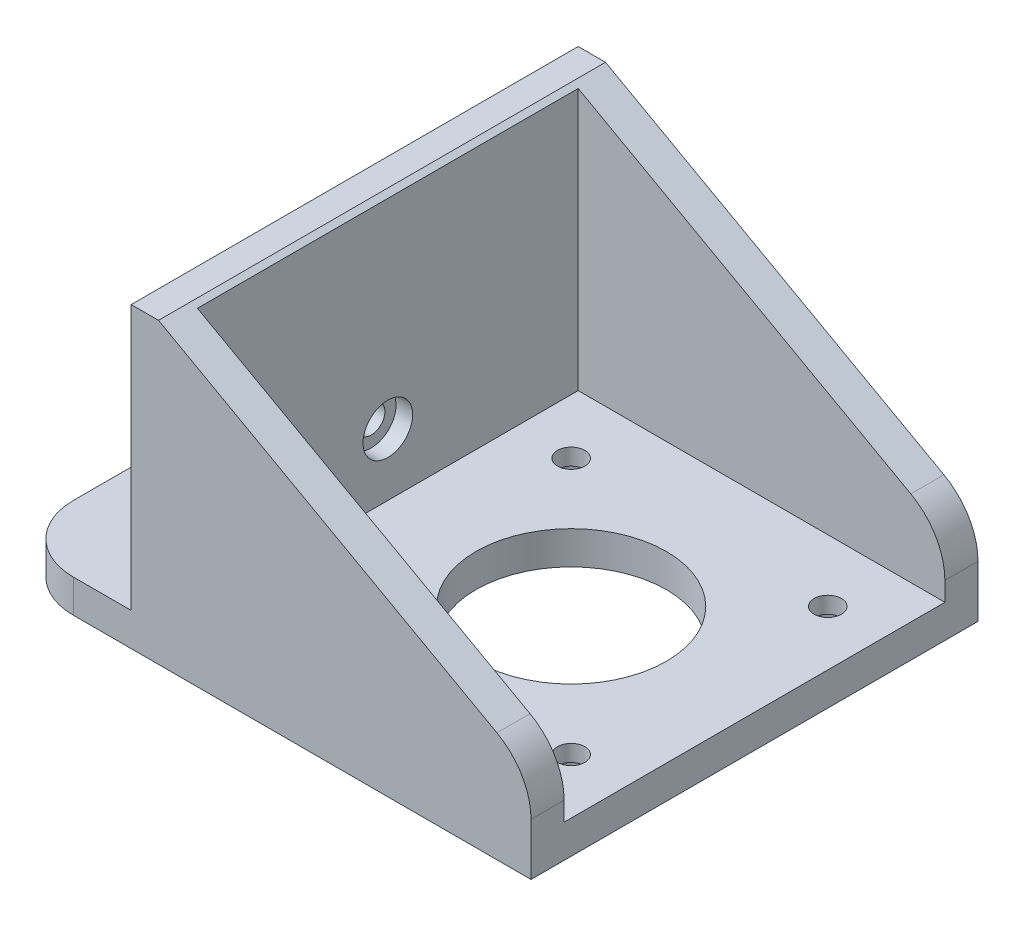
ISO-10303-21;
HEADER;
FILE_DESCRIPTION(('STEP AP214'),'2;1');
FILE_NAME('part.step','',(''),(''),'','','');
FILE_SCHEMA(('AUTOMOTIVE_DESIGN { 1 0 10303 214 1 1 1 1 }'));
ENDSEC;
DATA;
#1=APPLICATION_CONTEXT('core data for automotive mechanical design processes');
#2=APPLICATION_PROTOCOL_DEFINITION('international standard','automotive_design',2000,#1);
#3=PRODUCT_CONTEXT('',#1,'mechanical');
#4=PRODUCT('Part','Part','',(#3));
#5=PRODUCT_RELATED_PRODUCT_CATEGORY('part','',(#4));
#6=PRODUCT_DEFINITION_FORMATION('','',#4);
#7=PRODUCT_DEFINITION_CONTEXT('part definition',#1,'design');
#8=PRODUCT_DEFINITION('design','',#6,#7);
#9=PRODUCT_DEFINITION_SHAPE('','',#8);
#10=(LENGTH_UNIT() NAMED_UNIT(*) SI_UNIT(.MILLI.,.METRE.));
#11=(NAMED_UNIT(*) PLANE_ANGLE_UNIT() SI_UNIT($,.RADIAN.));
#12=(NAMED_UNIT(*) SI_UNIT($,.STERADIAN.) SOLID_ANGLE_UNIT());
#13=UNCERTAINTY_MEASURE_WITH_UNIT(LENGTH_MEASURE(1.E-05),#10,'distance_accuracy_value','');
#14=(GEOMETRIC_REPRESENTATION_CONTEXT(3) GLOBAL_UNCERTAINTY_ASSIGNED_CONTEXT((#13)) GLOBAL_UNIT_ASSIGNED_CONTEXT((#10,
#11,#12)) REPRESENTATION_CONTEXT('',''));
#15=CARTESIAN_POINT('',(0.,0.,0.));
#16=DIRECTION('',(0.,0.,1.));
#17=DIRECTION('',(1.,0.,0.));
#18=AXIS2_PLACEMENT_3D('',#15,#16,#17);
#19=CARTESIAN_POINT('',(236.65,65.998,245.5));
#20=DIRECTION('',(0.,1.,0.));
#21=DIRECTION('',(0.,0.,1.));
#22=AXIS2_PLACEMENT_3D('',#19,#20,#21);
#23=CYLINDRICAL_SURFACE('',#22,1.65);
#24=CARTESIAN_POINT('',(236.65,70.,245.5));
#25=DIRECTION('',(0.,-1.,0.));
#26=DIRECTION('',(1.,0.,0.));
#27=AXIS2_PLACEMENT_3D('',#24,#25,#26);
#28=CIRCLE('',#27,1.65);
#29=CARTESIAN_POINT('',(238.3,70.,245.5));
#30=VERTEX_POINT('',#29);
#31=EDGE_CURVE('E200',#30,#30,#28,.T.);
#32=ORIENTED_EDGE('',*,*,#31,.F.);
#33=EDGE_LOOP('',(#32));
#34=FACE_BOUND('',#33,.T.);
#35=CARTESIAN_POINT('',(236.65,68.,245.5));
#36=DIRECTION('',(0.,-1.,0.));
#37=DIRECTION('',(0.,0.,-1.));
#38=AXIS2_PLACEMENT_3D('',#35,#36,#37);
#39=CIRCLE('',#38,1.65);
#40=CARTESIAN_POINT('',(236.65,68.,243.85));
#41=VERTEX_POINT('',#40);
#42=EDGE_CURVE('E516',#41,#41,#39,.T.);
#43=ORIENTED_EDGE('',*,*,#42,.T.);
#44=EDGE_LOOP('',(#43));
#45=FACE_BOUND('',#44,.T.);
#46=ADVANCED_FACE('F16',(#34,#45),#23,.F.);
#47=CARTESIAN_POINT('',(205.65,65.998,245.5));
#48=DIRECTION('',(0.,1.,0.));
#49=DIRECTION('',(0.,0.,1.));
#50=AXIS2_PLACEMENT_3D('',#47,#48,#49);
#51=CYLINDRICAL_SURFACE('',#50,1.65);
#52=CARTESIAN_POINT('',(205.65,70.,245.5));
#53=DIRECTION('',(0.,-1.,0.));
#54=DIRECTION('',(1.,0.,0.));
#55=AXIS2_PLACEMENT_3D('',#52,#53,#54);
#56=CIRCLE('',#55,1.65);
#57=CARTESIAN_POINT('',(207.3,70.,245.5));
#58=VERTEX_POINT('',#57);
#59=EDGE_CURVE('E745',#58,#58,#56,.T.);
#60=ORIENTED_EDGE('',*,*,#59,.F.);
#61=EDGE_LOOP('',(#60));
#62=FACE_BOUND('',#61,.T.);
#63=CARTESIAN_POINT('',(205.65,68.,245.5));
#64=DIRECTION('',(0.,-1.,0.));
#65=DIRECTION('',(0.,0.,-1.));
#66=AXIS2_PLACEMENT_3D('',#63,#64,#65);
#67=CIRCLE('',#66,1.65);
#68=CARTESIAN_POINT('',(205.65,68.,243.85));
#69=VERTEX_POINT('',#68);
#70=EDGE_CURVE('E521',#69,#69,#67,.T.);
#71=ORIENTED_EDGE('',*,*,#70,.T.);
#72=EDGE_LOOP('',(#71));
#73=FACE_BOUND('',#72,.T.);
#74=ADVANCED_FACE('F653',(#62,#73),#51,.F.);
#75=CARTESIAN_POINT('',(205.65,65.998,214.5));
#76=DIRECTION('',(0.,1.,0.));
#77=DIRECTION('',(0.,0.,1.));
#78=AXIS2_PLACEMENT_3D('',#75,#76,#77);
#79=CYLINDRICAL_SURFACE('',#78,1.65);
#80=CARTESIAN_POINT('',(205.65,70.,214.5));
#81=DIRECTION('',(0.,-1.,0.));
#82=DIRECTION('',(1.,0.,0.));
#83=AXIS2_PLACEMENT_3D('',#80,#81,#82);
#84=CIRCLE('',#83,1.65);
#85=CARTESIAN_POINT('',(207.3,70.,214.5));
#86=VERTEX_POINT('',#85);
#87=EDGE_CURVE('E751',#86,#86,#84,.T.);
#88=ORIENTED_EDGE('',*,*,#87,.F.);
#89=EDGE_LOOP('',(#88));
#90=FACE_BOUND('',#89,.T.);
#91=CARTESIAN_POINT('',(205.65,68.,214.5));
#92=DIRECTION('',(0.,-1.,0.));
#93=DIRECTION('',(0.,0.,-1.));
#94=AXIS2_PLACEMENT_3D('',#91,#92,#93);
#95=CIRCLE('',#94,1.65);
#96=CARTESIAN_POINT('',(205.65,68.,212.85));
#97=VERTEX_POINT('',#96);
#98=EDGE_CURVE('E501',#97,#97,#95,.T.);
#99=ORIENTED_EDGE('',*,*,#98,.T.);
#100=EDGE_LOOP('',(#99));
#101=FACE_BOUND('',#100,.T.);
#102=ADVANCED_FACE('F660',(#90,#101),#79,.F.);
#103=CARTESIAN_POINT('',(236.65,65.998,214.5));
#104=DIRECTION('',(0.,1.,0.));
#105=DIRECTION('',(0.,0.,1.));
#106=AXIS2_PLACEMENT_3D('',#103,#104,#105);
#107=CYLINDRICAL_SURFACE('',#106,1.65);
#108=CARTESIAN_POINT('',(236.65,70.,214.5));
#109=DIRECTION('',(0.,-1.,0.));
#110=DIRECTION('',(1.,0.,0.));
#111=AXIS2_PLACEMENT_3D('',#108,#109,#110);
#112=CIRCLE('',#111,1.65);
#113=CARTESIAN_POINT('',(238.3,70.,214.5));
#114=VERTEX_POINT('',#113);
#115=EDGE_CURVE('E755',#114,#114,#112,.T.);
#116=ORIENTED_EDGE('',*,*,#115,.F.);
#117=EDGE_LOOP('',(#116));
#118=FACE_BOUND('',#117,.T.);
#119=CARTESIAN_POINT('',(236.65,68.,214.5));
#120=DIRECTION('',(0.,-1.,0.));
#121=DIRECTION('',(0.,0.,-1.));
#122=AXIS2_PLACEMENT_3D('',#119,#120,#121);
#123=CIRCLE('',#122,1.65);
#124=CARTESIAN_POINT('',(236.65,68.,212.85));
#125=VERTEX_POINT('',#124);
#126=EDGE_CURVE('E542',#125,#125,#123,.T.);
#127=ORIENTED_EDGE('',*,*,#126,.T.);
#128=EDGE_LOOP('',(#127));
#129=FACE_BOUND('',#128,.T.);
#130=ADVANCED_FACE('F665',(#118,#129),#107,.F.);
#131=CARTESIAN_POINT('',(187.5,70.002,215.));
#132=DIRECTION('',(0.,-1.,0.));
#133=DIRECTION('',(0.,0.,-1.));
#134=AXIS2_PLACEMENT_3D('',#131,#132,#133);
#135=CYLINDRICAL_SURFACE('',#134,1.65);
#136=CARTESIAN_POINT('',(187.5,70.,215.));
#137=DIRECTION('',(0.,-1.,0.));
#138=DIRECTION('',(0.,0.,-1.));
#139=AXIS2_PLACEMENT_3D('',#136,#137,#138);
#140=CIRCLE('',#139,1.65);
#141=CARTESIAN_POINT('',(187.5,70.,213.35));
#142=VERTEX_POINT('',#141);
#143=EDGE_CURVE('E470',#142,#142,#140,.F.);
#144=ORIENTED_EDGE('',*,*,#143,.T.);
#145=EDGE_LOOP('',(#144));
#146=FACE_BOUND('',#145,.T.);
#147=CARTESIAN_POINT('',(187.5,68.,215.));
#148=DIRECTION('',(0.,-1.,0.));
#149=DIRECTION('',(1.,0.,0.));
#150=AXIS2_PLACEMENT_3D('',#147,#148,#149);
#151=CIRCLE('',#150,1.65);
#152=CARTESIAN_POINT('',(189.15,68.,215.));
#153=VERTEX_POINT('',#152);
#154=EDGE_CURVE('E500',#153,#153,#151,.T.);
#155=ORIENTED_EDGE('',*,*,#154,.T.);
#156=EDGE_LOOP('',(#155));
#157=FACE_BOUND('',#156,.T.);
#158=ADVANCED_FACE('F669',(#146,#157),#135,.F.);
#159=CARTESIAN_POINT('',(187.5,70.002,245.));
#160=DIRECTION('',(0.,-1.,0.));
#161=DIRECTION('',(0.,0.,-1.));
#162=AXIS2_PLACEMENT_3D('',#159,#160,#161);
#163=CYLINDRICAL_SURFACE('',#162,1.65);
#164=CARTESIAN_POINT('',(187.5,70.,245.));
#165=DIRECTION('',(0.,-1.,0.));
#166=DIRECTION('',(0.,0.,-1.));
#167=AXIS2_PLACEMENT_3D('',#164,#165,#166);
#168=CIRCLE('',#167,1.65);
#169=CARTESIAN_POINT('',(187.5,70.,243.35));
#170=VERTEX_POINT('',#169);
#171=EDGE_CURVE('E424',#170,#170,#168,.F.);
#172=ORIENTED_EDGE('',*,*,#171,.T.);
#173=EDGE_LOOP('',(#172));
#174=FACE_BOUND('',#173,.T.);
#175=CARTESIAN_POINT('',(187.5,68.,245.));
#176=DIRECTION('',(0.,-1.,0.));
#177=DIRECTION('',(1.,0.,0.));
#178=AXIS2_PLACEMENT_3D('',#175,#176,#177);
#179=CIRCLE('',#178,1.65);
#180=CARTESIAN_POINT('',(189.15,68.,245.));
#181=VERTEX_POINT('',#180);
#182=EDGE_CURVE('E475',#181,#181,#179,.T.);
#183=ORIENTED_EDGE('',*,*,#182,.T.);
#184=EDGE_LOOP('',(#183));
#185=FACE_BOUND('',#184,.T.);
#186=ADVANCED_FACE('F457',(#174,#185),#163,.F.);
#187=CARTESIAN_POINT('',(194.998,77.5,230.));
#188=DIRECTION('',(1.,0.,0.));
#189=DIRECTION('',(0.,0.,-1.));
#190=AXIS2_PLACEMENT_3D('',#187,#188,#189);
#191=CYLINDRICAL_SURFACE('',#190,1.65);
#192=CARTESIAN_POINT('',(195.,77.5,230.));
#193=DIRECTION('',(-1.,0.,0.));
#194=DIRECTION('',(0.,0.,1.));
#195=AXIS2_PLACEMENT_3D('',#192,#193,#194);
#196=CIRCLE('',#195,1.65);
#197=CARTESIAN_POINT('',(195.,77.5,231.65));
#198=VERTEX_POINT('',#197);
#199=EDGE_CURVE('E417',#198,#198,#196,.F.);
#200=ORIENTED_EDGE('',*,*,#199,.F.);
#201=EDGE_LOOP('',(#200));
#202=FACE_BOUND('',#201,.T.);
#203=CARTESIAN_POINT('',(197.,77.5,230.));
#204=DIRECTION('',(1.,0.,0.));
#205=DIRECTION('',(0.,1.,0.));
#206=AXIS2_PLACEMENT_3D('',#203,#204,#205);
#207=CIRCLE('',#206,1.65);
#208=CARTESIAN_POINT('',(197.,79.15,230.));
#209=VERTEX_POINT('',#208);
#210=EDGE_CURVE('E423',#209,#209,#207,.T.);
#211=ORIENTED_EDGE('',*,*,#210,.T.);
#212=EDGE_LOOP('',(#211));
#213=FACE_BOUND('',#212,.T.);
#214=ADVANCED_FACE('F453',(#202,#213),#191,.F.);
#215=CARTESIAN_POINT('',(211.65,70.,195.));
#216=DIRECTION('',(0.,-1.,0.));
#217=DIRECTION('',(1.,0.,0.));
#218=AXIS2_PLACEMENT_3D('',#215,#216,#217);
#219=PLANE('',#218);
#220=ORIENTED_EDGE('',*,*,#171,.F.);
#221=EDGE_LOOP('',(#220));
#222=FACE_BOUND('',#221,.T.);
#223=ORIENTED_EDGE('',*,*,#143,.F.);
#224=EDGE_LOOP('',(#223));
#225=FACE_BOUND('',#224,.T.);
#226=DIRECTION('',(1.,0.,0.));
#227=VECTOR('',#226,1.);
#228=CARTESIAN_POINT('',(201.912239193917,70.,203.));
#229=LINE('',#228,#227);
#230=CARTESIAN_POINT('',(188.,70.,203.));
#231=VERTEX_POINT('',#230);
#232=CARTESIAN_POINT('',(195.,70.,203.));
#233=VERTEX_POINT('',#232);
#234=EDGE_CURVE('E237',#231,#233,#229,.T.);
#235=ORIENTED_EDGE('',*,*,#234,.F.);
#236=CARTESIAN_POINT('',(188.,70.,211.));
#237=DIRECTION('',(0.,-1.,0.));
#238=DIRECTION('',(0.,0.,-1.));
#239=AXIS2_PLACEMENT_3D('',#236,#237,#238);
#240=CIRCLE('',#239,8.);
#241=CARTESIAN_POINT('',(180.,70.,211.));
#242=VERTEX_POINT('',#241);
#243=EDGE_CURVE('E278',#231,#242,#240,.F.);
#244=ORIENTED_EDGE('',*,*,#243,.T.);
#245=DIRECTION('',(0.,0.,-1.));
#246=VECTOR('',#245,1.);
#247=CARTESIAN_POINT('',(180.,70.,375.));
#248=LINE('',#247,#246);
#249=CARTESIAN_POINT('',(180.,70.,249.));
#250=VERTEX_POINT('',#249);
#251=EDGE_CURVE('E223',#250,#242,#248,.T.);
#252=ORIENTED_EDGE('',*,*,#251,.F.);
#253=CARTESIAN_POINT('',(188.,70.,249.));
#254=DIRECTION('',(0.,-1.,0.));
#255=DIRECTION('',(0.,0.,-1.));
#256=AXIS2_PLACEMENT_3D('',#253,#254,#255);
#257=CIRCLE('',#256,8.);
#258=CARTESIAN_POINT('',(188.,70.,257.));
#259=VERTEX_POINT('',#258);
#260=EDGE_CURVE('E275',#250,#259,#257,.F.);
#261=ORIENTED_EDGE('',*,*,#260,.T.);
#262=DIRECTION('',(1.,0.,0.));
#263=VECTOR('',#262,1.);
#264=CARTESIAN_POINT('',(201.912239193917,70.,257.));
#265=LINE('',#264,#263);
#266=CARTESIAN_POINT('',(195.,70.,257.));
#267=VERTEX_POINT('',#266);
#268=EDGE_CURVE('E179',#259,#267,#265,.T.);
#269=ORIENTED_EDGE('',*,*,#268,.T.);
#270=DIRECTION('',(0.,0.,-1.));
#271=VECTOR('',#270,1.);
#272=CARTESIAN_POINT('',(195.,70.,375.));
#273=LINE('',#272,#271);
#274=EDGE_CURVE('E170',#267,#233,#273,.T.);
#275=ORIENTED_EDGE('',*,*,#274,.T.);
#276=EDGE_LOOP('',(#235,#244,#252,#261,#269,#275));
#277=FACE_BOUND('',#276,.T.);
#278=ADVANCED_FACE('F373',(#222,#225,#277),#219,.F.);
#279=CARTESIAN_POINT('',(243.3,66.,226.137097533027));
#280=DIRECTION('',(1.,0.,0.));
#281=DIRECTION('',(0.,0.,-1.));
#282=AXIS2_PLACEMENT_3D('',#279,#280,#281);
#283=PLANE('',#282);
#284=DIRECTION('',(0.,1.,0.));
#285=VECTOR('',#284,1.);
#286=CARTESIAN_POINT('',(243.3,66.,203.));
#287=LINE('',#286,#285);
#288=CARTESIAN_POINT('',(243.3,66.,203.));
#289=VERTEX_POINT('',#288);
#290=CARTESIAN_POINT('',(243.3,72.2927732080116,203.));
#291=VERTEX_POINT('',#290);
#292=EDGE_CURVE('E234',#289,#291,#287,.T.);
#293=ORIENTED_EDGE('',*,*,#292,.T.);
#294=DIRECTION('',(0.,0.,1.));
#295=VECTOR('',#294,1.);
#296=CARTESIAN_POINT('',(243.3,72.2927732080116,226.137097533027));
#297=LINE('',#296,#295);
#298=CARTESIAN_POINT('',(243.3,72.2927732080116,207.));
#299=VERTEX_POINT('',#298);
#300=EDGE_CURVE('E301',#291,#299,#297,.T.);
#301=ORIENTED_EDGE('',*,*,#300,.T.);
#302=DIRECTION('',(0.,-1.,0.));
#303=VECTOR('',#302,1.);
#304=CARTESIAN_POINT('',(243.3,102.,207.));
#305=LINE('',#304,#303);
#306=CARTESIAN_POINT('',(243.3,70.,207.));
#307=VERTEX_POINT('',#306);
#308=EDGE_CURVE('E210',#299,#307,#305,.T.);
#309=ORIENTED_EDGE('',*,*,#308,.T.);
#310=DIRECTION('',(0.,0.,-1.));
#311=VECTOR('',#310,1.);
#312=CARTESIAN_POINT('',(243.3,70.,226.137097533027));
#313=LINE('',#312,#311);
#314=CARTESIAN_POINT('',(243.3,70.,253.));
#315=VERTEX_POINT('',#314);
#316=EDGE_CURVE('E240',#315,#307,#313,.T.);
#317=ORIENTED_EDGE('',*,*,#316,.F.);
#318=DIRECTION('',(0.,-1.,0.));
#319=VECTOR('',#318,1.);
#320=CARTESIAN_POINT('',(243.3,102.,253.));
#321=LINE('',#320,#319);
#322=CARTESIAN_POINT('',(243.3,72.2927732080116,253.));
#323=VERTEX_POINT('',#322);
#324=EDGE_CURVE('E186',#323,#315,#321,.T.);
#325=ORIENTED_EDGE('',*,*,#324,.F.);
#326=DIRECTION('',(0.,0.,1.));
#327=VECTOR('',#326,1.);
#328=CARTESIAN_POINT('',(243.3,72.2927732080116,226.137097533027));
#329=LINE('',#328,#327);
#330=CARTESIAN_POINT('',(243.3,72.2927732080116,257.));
#331=VERTEX_POINT('',#330);
#332=EDGE_CURVE('E297',#323,#331,#329,.T.);
#333=ORIENTED_EDGE('',*,*,#332,.T.);
#334=DIRECTION('',(0.,1.,0.));
#335=VECTOR('',#334,1.);
#336=CARTESIAN_POINT('',(243.3,66.,257.));
#337=LINE('',#336,#335);
#338=CARTESIAN_POINT('',(243.3,66.,257.));
#339=VERTEX_POINT('',#338);
#340=EDGE_CURVE('E250',#339,#331,#337,.T.);
#341=ORIENTED_EDGE('',*,*,#340,.F.);
#342=DIRECTION('',(0.,0.,-1.));
#343=VECTOR('',#342,1.);
#344=CARTESIAN_POINT('',(243.3,66.,226.137097533027));
#345=LINE('',#344,#343);
#346=EDGE_CURVE('E226',#339,#289,#345,.T.);
#347=ORIENTED_EDGE('',*,*,#346,.T.);
#348=EDGE_LOOP('',(#293,#301,#309,#317,#325,#333,#341,#347));
#349=FACE_BOUND('',#348,.T.);
#350=ADVANCED_FACE('F369',(#349),#283,.T.);
#351=CARTESIAN_POINT('',(201.912239193917,66.,257.));
#352=DIRECTION('',(0.,0.,1.));
#353=DIRECTION('',(1.,0.,0.));
#354=AXIS2_PLACEMENT_3D('',#351,#352,#353);
#355=PLANE('',#354);
#356=ORIENTED_EDGE('',*,*,#340,.T.);
#357=CARTESIAN_POINT('',(235.3,72.2927732080116,257.));
#358=DIRECTION('',(0.,0.,1.));
#359=DIRECTION('',(1.,0.,0.));
#360=AXIS2_PLACEMENT_3D('',#357,#358,#359);
#361=CIRCLE('',#360,8.);
#362=CARTESIAN_POINT('',(239.185143449429,79.2860314169839,257.));
#363=VERTEX_POINT('',#362);
#364=EDGE_CURVE('E25',#331,#363,#361,.T.);
#365=ORIENTED_EDGE('',*,*,#364,.T.);
#366=DIRECTION('',(-0.874157276121538,0.485642931178632,0.));
#367=VECTOR('',#366,1.);
#368=CARTESIAN_POINT('',(216.343314855728,91.9759361912619,257.));
#369=LINE('',#368,#367);
#370=CARTESIAN_POINT('',(198.3,102.,257.));
#371=VERTEX_POINT('',#370);
#372=EDGE_CURVE('E164',#363,#371,#369,.T.);
#373=ORIENTED_EDGE('',*,*,#372,.T.);
#374=DIRECTION('',(-1.,0.,0.));
#375=VECTOR('',#374,1.);
#376=CARTESIAN_POINT('',(223.021676135606,102.,257.));
#377=LINE('',#376,#375);
#378=CARTESIAN_POINT('',(195.,102.,257.));
#379=VERTEX_POINT('',#378);
#380=EDGE_CURVE('E158',#371,#379,#377,.T.);
#381=ORIENTED_EDGE('',*,*,#380,.T.);
#382=DIRECTION('',(0.,-1.,0.));
#383=VECTOR('',#382,1.);
#384=CARTESIAN_POINT('',(195.,102.,257.));
#385=LINE('',#384,#383);
#386=EDGE_CURVE('E162',#379,#267,#385,.T.);
#387=ORIENTED_EDGE('',*,*,#386,.T.);
#388=ORIENTED_EDGE('',*,*,#268,.F.);
#389=DIRECTION('',(0.,1.,0.));
#390=VECTOR('',#389,1.);
#391=CARTESIAN_POINT('',(188.,66.,257.));
#392=LINE('',#391,#390);
#393=CARTESIAN_POINT('',(188.,66.,257.));
#394=VERTEX_POINT('',#393);
#395=EDGE_CURVE('E294',#259,#394,#392,.F.);
#396=ORIENTED_EDGE('',*,*,#395,.T.);
#397=DIRECTION('',(1.,0.,0.));
#398=VECTOR('',#397,1.);
#399=CARTESIAN_POINT('',(201.912239193917,66.,257.));
#400=LINE('',#399,#398);
#401=EDGE_CURVE('E219',#394,#339,#400,.T.);
#402=ORIENTED_EDGE('',*,*,#401,.T.);
#403=EDGE_LOOP('',(#356,#365,#373,#381,#387,#388,#396,#402));
#404=FACE_BOUND('',#403,.T.);
#405=ADVANCED_FACE('F160',(#404),#355,.T.);
#406=CARTESIAN_POINT('',(180.,66.,375.));
#407=DIRECTION('',(1.,0.,0.));
#408=DIRECTION('',(0.,0.,-1.));
#409=AXIS2_PLACEMENT_3D('',#406,#407,#408);
#410=PLANE('',#409);
#411=ORIENTED_EDGE('',*,*,#251,.T.);
#412=DIRECTION('',(0.,1.,0.));
#413=VECTOR('',#412,1.);
#414=CARTESIAN_POINT('',(180.,66.,211.));
#415=LINE('',#414,#413);
#416=CARTESIAN_POINT('',(180.,66.,211.));
#417=VERTEX_POINT('',#416);
#418=EDGE_CURVE('E285',#242,#417,#415,.F.);
#419=ORIENTED_EDGE('',*,*,#418,.T.);
#420=DIRECTION('',(0.,0.,-1.));
#421=VECTOR('',#420,1.);
#422=CARTESIAN_POINT('',(180.,66.,375.));
#423=LINE('',#422,#421);
#424=CARTESIAN_POINT('',(180.,66.,249.));
#425=VERTEX_POINT('',#424);
#426=EDGE_CURVE('E230',#425,#417,#423,.T.);
#427=ORIENTED_EDGE('',*,*,#426,.F.);
#428=DIRECTION('',(0.,1.,0.));
#429=VECTOR('',#428,1.);
#430=CARTESIAN_POINT('',(180.,70.,249.));
#431=LINE('',#430,#429);
#432=EDGE_CURVE('E281',#425,#250,#431,.T.);
#433=ORIENTED_EDGE('',*,*,#432,.T.);
#434=EDGE_LOOP('',(#411,#419,#427,#433));
#435=FACE_BOUND('',#434,.T.);
#436=ADVANCED_FACE('F381',(#435),#410,.F.);
#437=CARTESIAN_POINT('',(201.912239193917,66.,203.));
#438=DIRECTION('',(0.,0.,1.));
#439=DIRECTION('',(1.,0.,0.));
#440=AXIS2_PLACEMENT_3D('',#437,#438,#439);
#441=PLANE('',#440);
#442=DIRECTION('',(0.874157276121538,-0.485642931178632,0.));
#443=VECTOR('',#442,1.);
#444=CARTESIAN_POINT('',(243.3,77.,203.));
#445=LINE('',#444,#443);
#446=CARTESIAN_POINT('',(198.3,102.,203.));
#447=VERTEX_POINT('',#446);
#448=CARTESIAN_POINT('',(239.185143449429,79.2860314169839,203.));
#449=VERTEX_POINT('',#448);
#450=EDGE_CURVE('E262',#447,#449,#445,.T.);
#451=ORIENTED_EDGE('',*,*,#450,.T.);
#452=CARTESIAN_POINT('',(235.3,72.2927732080116,203.));
#453=DIRECTION('',(0.,0.,1.));
#454=DIRECTION('',(1.,0.,0.));
#455=AXIS2_PLACEMENT_3D('',#452,#453,#454);
#456=CIRCLE('',#455,8.);
#457=EDGE_CURVE('E313',#449,#291,#456,.F.);
#458=ORIENTED_EDGE('',*,*,#457,.T.);
#459=ORIENTED_EDGE('',*,*,#292,.F.);
#460=DIRECTION('',(1.,0.,0.));
#461=VECTOR('',#460,1.);
#462=CARTESIAN_POINT('',(201.912239193917,66.,203.));
#463=LINE('',#462,#461);
#464=CARTESIAN_POINT('',(188.,66.,203.));
#465=VERTEX_POINT('',#464);
#466=EDGE_CURVE('E222',#465,#289,#463,.T.);
#467=ORIENTED_EDGE('',*,*,#466,.F.);
#468=DIRECTION('',(0.,1.,0.));
#469=VECTOR('',#468,1.);
#470=CARTESIAN_POINT('',(188.,66.,203.));
#471=LINE('',#470,#469);
#472=EDGE_CURVE('E271',#465,#231,#471,.T.);
#473=ORIENTED_EDGE('',*,*,#472,.T.);
#474=ORIENTED_EDGE('',*,*,#234,.T.);
#475=DIRECTION('',(0.,-1.,0.));
#476=VECTOR('',#475,1.);
#477=CARTESIAN_POINT('',(195.,102.,203.));
#478=LINE('',#477,#476);
#479=CARTESIAN_POINT('',(195.,102.,203.));
#480=VERTEX_POINT('',#479);
#481=EDGE_CURVE('E180',#480,#233,#478,.T.);
#482=ORIENTED_EDGE('',*,*,#481,.F.);
#483=DIRECTION('',(-1.,0.,0.));
#484=VECTOR('',#483,1.);
#485=CARTESIAN_POINT('',(223.021676135606,102.,203.));
#486=LINE('',#485,#484);
#487=EDGE_CURVE('E169',#447,#480,#486,.T.);
#488=ORIENTED_EDGE('',*,*,#487,.F.);
#489=EDGE_LOOP('',(#451,#458,#459,#467,#473,#474,#482,#488));
#490=FACE_BOUND('',#489,.T.);
#491=ADVANCED_FACE('F385',(#490),#441,.F.);
#492=CARTESIAN_POINT('',(211.65,66.,195.));
#493=DIRECTION('',(0.,-1.,0.));
#494=DIRECTION('',(1.,0.,0.));
#495=AXIS2_PLACEMENT_3D('',#492,#493,#494);
#496=PLANE('',#495);
#497=CARTESIAN_POINT('',(187.5,66.,215.));
#498=DIRECTION('',(0.,-1.,0.));
#499=DIRECTION('',(1.,0.,0.));
#500=AXIS2_PLACEMENT_3D('',#497,#498,#499);
#501=CIRCLE('',#500,3.);
#502=CARTESIAN_POINT('',(190.5,66.,215.));
#503=VERTEX_POINT('',#502);
#504=EDGE_CURVE('E496',#503,#503,#501,.T.);
#505=ORIENTED_EDGE('',*,*,#504,.F.);
#506=EDGE_LOOP('',(#505));
#507=FACE_BOUND('',#506,.T.);
#508=CARTESIAN_POINT('',(205.65,66.,214.5));
#509=DIRECTION('',(0.,-1.,0.));
#510=DIRECTION('',(1.,0.,0.));
#511=AXIS2_PLACEMENT_3D('',#508,#509,#510);
#512=CIRCLE('',#511,3.);
#513=CARTESIAN_POINT('',(208.65,66.,214.5));
#514=VERTEX_POINT('',#513);
#515=EDGE_CURVE('E523',#514,#514,#512,.T.);
#516=ORIENTED_EDGE('',*,*,#515,.F.);
#517=EDGE_LOOP('',(#516));
#518=FACE_BOUND('',#517,.T.);
#519=CARTESIAN_POINT('',(205.65,66.,245.5));
#520=DIRECTION('',(0.,-1.,0.));
#521=DIRECTION('',(1.,0.,0.));
#522=AXIS2_PLACEMENT_3D('',#519,#520,#521);
#523=CIRCLE('',#522,3.);
#524=CARTESIAN_POINT('',(208.65,66.,245.5));
#525=VERTEX_POINT('',#524);
#526=EDGE_CURVE('E511',#525,#525,#523,.T.);
#527=ORIENTED_EDGE('',*,*,#526,.F.);
#528=EDGE_LOOP('',(#527));
#529=FACE_BOUND('',#528,.T.);
#530=CARTESIAN_POINT('',(236.65,66.,245.5));
#531=DIRECTION('',(0.,-1.,0.));
#532=DIRECTION('',(1.,0.,0.));
#533=AXIS2_PLACEMENT_3D('',#530,#531,#532);
#534=CIRCLE('',#533,3.);
#535=CARTESIAN_POINT('',(239.65,66.,245.5));
#536=VERTEX_POINT('',#535);
#537=EDGE_CURVE('E544',#536,#536,#534,.T.);
#538=ORIENTED_EDGE('',*,*,#537,.F.);
#539=EDGE_LOOP('',(#538));
#540=FACE_BOUND('',#539,.T.);
#541=CARTESIAN_POINT('',(236.65,66.,214.5));
#542=DIRECTION('',(0.,-1.,0.));
#543=DIRECTION('',(1.,0.,0.));
#544=AXIS2_PLACEMENT_3D('',#541,#542,#543);
#545=CIRCLE('',#544,3.);
#546=CARTESIAN_POINT('',(239.65,66.,214.5));
#547=VERTEX_POINT('',#546);
#548=EDGE_CURVE('E533',#547,#547,#545,.T.);
#549=ORIENTED_EDGE('',*,*,#548,.F.);
#550=EDGE_LOOP('',(#549));
#551=FACE_BOUND('',#550,.T.);
#552=CARTESIAN_POINT('',(187.5,66.,245.));
#553=DIRECTION('',(0.,-1.,0.));
#554=DIRECTION('',(1.,0.,0.));
#555=AXIS2_PLACEMENT_3D('',#552,#553,#554);
#556=CIRCLE('',#555,3.);
#557=CARTESIAN_POINT('',(190.5,66.,245.));
#558=VERTEX_POINT('',#557);
#559=EDGE_CURVE('E481',#558,#558,#556,.T.);
#560=ORIENTED_EDGE('',*,*,#559,.F.);
#561=EDGE_LOOP('',(#560));
#562=FACE_BOUND('',#561,.T.);
#563=CARTESIAN_POINT('',(221.15,66.,230.));
#564=DIRECTION('',(0.,-1.,0.));
#565=DIRECTION('',(0.,0.,-1.));
#566=AXIS2_PLACEMENT_3D('',#563,#564,#565);
#567=CIRCLE('',#566,11.5);
#568=CARTESIAN_POINT('',(221.15,66.,218.5));
#569=VERTEX_POINT('',#568);
#570=EDGE_CURVE('E740',#569,#569,#567,.T.);
#571=ORIENTED_EDGE('',*,*,#570,.F.);
#572=EDGE_LOOP('',(#571));
#573=FACE_BOUND('',#572,.T.);
#574=ORIENTED_EDGE('',*,*,#426,.T.);
#575=CARTESIAN_POINT('',(188.,66.,211.));
#576=DIRECTION('',(0.,-1.,0.));
#577=DIRECTION('',(0.,0.,-1.));
#578=AXIS2_PLACEMENT_3D('',#575,#576,#577);
#579=CIRCLE('',#578,8.);
#580=EDGE_CURVE('E291',#417,#465,#579,.T.);
#581=ORIENTED_EDGE('',*,*,#580,.T.);
#582=ORIENTED_EDGE('',*,*,#466,.T.);
#583=ORIENTED_EDGE('',*,*,#346,.F.);
#584=ORIENTED_EDGE('',*,*,#401,.F.);
#585=CARTESIAN_POINT('',(188.,66.,249.));
#586=DIRECTION('',(0.,-1.,0.));
#587=DIRECTION('',(0.,0.,-1.));
#588=AXIS2_PLACEMENT_3D('',#585,#586,#587);
#589=CIRCLE('',#588,8.);
#590=EDGE_CURVE('E288',#394,#425,#589,.T.);
#591=ORIENTED_EDGE('',*,*,#590,.T.);
#592=EDGE_LOOP('',(#574,#581,#582,#583,#584,#591));
#593=FACE_BOUND('',#592,.T.);
#594=ADVANCED_FACE('F388',(#507,#518,#529,#540,#551,#562,#573,#593),#496,.T.);
#595=ORIENTED_EDGE('',*,*,#115,.T.);
#596=EDGE_LOOP('',(#595));
#597=FACE_BOUND('',#596,.T.);
#598=ORIENTED_EDGE('',*,*,#87,.T.);
#599=EDGE_LOOP('',(#598));
#600=FACE_BOUND('',#599,.T.);
#601=ORIENTED_EDGE('',*,*,#59,.T.);
#602=EDGE_LOOP('',(#601));
#603=FACE_BOUND('',#602,.T.);
#604=CARTESIAN_POINT('',(221.15,70.,230.));
#605=DIRECTION('',(0.,-1.,0.));
#606=DIRECTION('',(1.,0.,0.));
#607=AXIS2_PLACEMENT_3D('',#604,#605,#606);
#608=CIRCLE('',#607,11.5);
#609=CARTESIAN_POINT('',(232.65,70.,230.));
#610=VERTEX_POINT('',#609);
#611=EDGE_CURVE('E744',#610,#610,#608,.T.);
#612=ORIENTED_EDGE('',*,*,#611,.T.);
#613=EDGE_LOOP('',(#612));
#614=FACE_BOUND('',#613,.T.);
#615=ORIENTED_EDGE('',*,*,#31,.T.);
#616=EDGE_LOOP('',(#615));
#617=FACE_BOUND('',#616,.T.);
#618=ORIENTED_EDGE('',*,*,#316,.T.);
#619=DIRECTION('',(-1.,0.,0.));
#620=VECTOR('',#619,1.);
#621=CARTESIAN_POINT('',(219.278323864394,70.,207.));
#622=LINE('',#621,#620);
#623=CARTESIAN_POINT('',(199.,70.,207.));
#624=VERTEX_POINT('',#623);
#625=EDGE_CURVE('E199',#307,#624,#622,.T.);
#626=ORIENTED_EDGE('',*,*,#625,.T.);
#627=DIRECTION('',(0.,0.,-1.));
#628=VECTOR('',#627,1.);
#629=CARTESIAN_POINT('',(199.,70.,225.549256801605));
#630=LINE('',#629,#628);
#631=CARTESIAN_POINT('',(199.,70.,253.));
#632=VERTEX_POINT('',#631);
#633=EDGE_CURVE('E204',#632,#624,#630,.T.);
#634=ORIENTED_EDGE('',*,*,#633,.F.);
#635=DIRECTION('',(-1.,0.,0.));
#636=VECTOR('',#635,1.);
#637=CARTESIAN_POINT('',(215.42397542054,70.,253.));
#638=LINE('',#637,#636);
#639=EDGE_CURVE('E195',#315,#632,#638,.T.);
#640=ORIENTED_EDGE('',*,*,#639,.F.);
#641=EDGE_LOOP('',(#618,#626,#634,#640));
#642=FACE_BOUND('',#641,.T.);
#643=ADVANCED_FACE('F399',(#597,#600,#603,#614,#617,#642),#219,.F.);
#644=CARTESIAN_POINT('',(195.,102.,375.));
#645=DIRECTION('',(-1.,0.,0.));
#646=DIRECTION('',(0.,0.,1.));
#647=AXIS2_PLACEMENT_3D('',#644,#645,#646);
#648=PLANE('',#647);
#649=ORIENTED_EDGE('',*,*,#199,.T.);
#650=EDGE_LOOP('',(#649));
#651=FACE_BOUND('',#650,.T.);
#652=ORIENTED_EDGE('',*,*,#274,.F.);
#653=ORIENTED_EDGE('',*,*,#386,.F.);
#654=DIRECTION('',(0.,0.,-1.));
#655=VECTOR('',#654,1.);
#656=CARTESIAN_POINT('',(195.,102.,375.));
#657=LINE('',#656,#655);
#658=EDGE_CURVE('E176',#379,#480,#657,.T.);
#659=ORIENTED_EDGE('',*,*,#658,.T.);
#660=ORIENTED_EDGE('',*,*,#481,.T.);
#661=EDGE_LOOP('',(#652,#653,#659,#660));
#662=FACE_BOUND('',#661,.T.);
#663=ADVANCED_FACE('F174',(#651,#662),#648,.T.);
#664=CARTESIAN_POINT('',(219.278323864394,102.,207.));
#665=DIRECTION('',(0.,0.,1.));
#666=DIRECTION('',(1.,0.,0.));
#667=AXIS2_PLACEMENT_3D('',#664,#665,#666);
#668=PLANE('',#667);
#669=ORIENTED_EDGE('',*,*,#308,.F.);
#670=CARTESIAN_POINT('',(235.3,72.2927732080116,207.));
#671=DIRECTION('',(0.,0.,1.));
#672=DIRECTION('',(1.,0.,0.));
#673=AXIS2_PLACEMENT_3D('',#670,#671,#672);
#674=CIRCLE('',#673,8.);
#675=CARTESIAN_POINT('',(239.185143449429,79.2860314169839,207.));
#676=VERTEX_POINT('',#675);
#677=EDGE_CURVE('E305',#299,#676,#674,.T.);
#678=ORIENTED_EDGE('',*,*,#677,.T.);
#679=DIRECTION('',(-0.874157276121538,0.485642931178632,0.));
#680=VECTOR('',#679,1.);
#681=CARTESIAN_POINT('',(214.330605971848,93.0941077934176,207.));
#682=LINE('',#681,#680);
#683=CARTESIAN_POINT('',(199.,101.611111111111,207.));
#684=VERTEX_POINT('',#683);
#685=EDGE_CURVE('E253',#676,#684,#682,.T.);
#686=ORIENTED_EDGE('',*,*,#685,.T.);
#687=DIRECTION('',(0.,-1.,0.));
#688=VECTOR('',#687,1.);
#689=CARTESIAN_POINT('',(199.,102.,207.));
#690=LINE('',#689,#688);
#691=EDGE_CURVE('E212',#684,#624,#690,.T.);
#692=ORIENTED_EDGE('',*,*,#691,.T.);
#693=ORIENTED_EDGE('',*,*,#625,.F.);
#694=EDGE_LOOP('',(#669,#678,#686,#692,#693));
#695=FACE_BOUND('',#694,.T.);
#696=ADVANCED_FACE('F361',(#695),#668,.T.);
#697=CARTESIAN_POINT('',(199.,102.,225.549256801605));
#698=DIRECTION('',(-1.,0.,0.));
#699=DIRECTION('',(0.,0.,1.));
#700=AXIS2_PLACEMENT_3D('',#697,#698,#699);
#701=PLANE('',#700);
#702=CARTESIAN_POINT('',(199.,77.5,230.));
#703=DIRECTION('',(1.,0.,0.));
#704=DIRECTION('',(0.,1.,0.));
#705=AXIS2_PLACEMENT_3D('',#702,#703,#704);
#706=CIRCLE('',#705,3.);
#707=CARTESIAN_POINT('',(199.,80.5,230.));
#708=VERTEX_POINT('',#707);
#709=EDGE_CURVE('E419',#708,#708,#706,.T.);
#710=ORIENTED_EDGE('',*,*,#709,.F.);
#711=EDGE_LOOP('',(#710));
#712=FACE_BOUND('',#711,.T.);
#713=ORIENTED_EDGE('',*,*,#691,.F.);
#714=DIRECTION('',(0.,0.,1.));
#715=VECTOR('',#714,1.);
#716=CARTESIAN_POINT('',(199.,101.611111111111,195.));
#717=LINE('',#716,#715);
#718=CARTESIAN_POINT('',(199.,101.611111111111,253.));
#719=VERTEX_POINT('',#718);
#720=EDGE_CURVE('E256',#684,#719,#717,.T.);
#721=ORIENTED_EDGE('',*,*,#720,.T.);
#722=DIRECTION('',(0.,-1.,0.));
#723=VECTOR('',#722,1.);
#724=CARTESIAN_POINT('',(199.,102.,253.));
#725=LINE('',#724,#723);
#726=EDGE_CURVE('E190',#719,#632,#725,.T.);
#727=ORIENTED_EDGE('',*,*,#726,.T.);
#728=ORIENTED_EDGE('',*,*,#633,.T.);
#729=EDGE_LOOP('',(#713,#721,#727,#728));
#730=FACE_BOUND('',#729,.T.);
#731=ADVANCED_FACE('F356',(#712,#730),#701,.F.);
#732=CARTESIAN_POINT('',(215.42397542054,102.,253.));
#733=DIRECTION('',(0.,0.,1.));
#734=DIRECTION('',(1.,0.,0.));
#735=AXIS2_PLACEMENT_3D('',#732,#733,#734);
#736=PLANE('',#735);
#737=DIRECTION('',(0.874157276121538,-0.485642931178632,0.));
#738=VECTOR('',#737,1.);
#739=CARTESIAN_POINT('',(198.3,102.,253.));
#740=LINE('',#739,#738);
#741=CARTESIAN_POINT('',(239.185143449429,79.2860314169839,253.));
#742=VERTEX_POINT('',#741);
#743=EDGE_CURVE('E265',#719,#742,#740,.T.);
#744=ORIENTED_EDGE('',*,*,#743,.T.);
#745=CARTESIAN_POINT('',(235.3,72.2927732080116,253.));
#746=DIRECTION('',(0.,0.,1.));
#747=DIRECTION('',(1.,0.,0.));
#748=AXIS2_PLACEMENT_3D('',#745,#746,#747);
#749=CIRCLE('',#748,8.);
#750=EDGE_CURVE('E10',#742,#323,#749,.F.);
#751=ORIENTED_EDGE('',*,*,#750,.T.);
#752=ORIENTED_EDGE('',*,*,#324,.T.);
#753=ORIENTED_EDGE('',*,*,#639,.T.);
#754=ORIENTED_EDGE('',*,*,#726,.F.);
#755=EDGE_LOOP('',(#744,#751,#752,#753,#754));
#756=FACE_BOUND('',#755,.T.);
#757=ADVANCED_FACE('F352',(#756),#736,.F.);
#758=CARTESIAN_POINT('',(211.65,102.,195.));
#759=DIRECTION('',(0.,-1.,0.));
#760=DIRECTION('',(1.,0.,0.));
#761=AXIS2_PLACEMENT_3D('',#758,#759,#760);
#762=PLANE('',#761);
#763=DIRECTION('',(0.,0.,-1.));
#764=VECTOR('',#763,1.);
#765=CARTESIAN_POINT('',(198.3,102.,253.));
#766=LINE('',#765,#764);
#767=EDGE_CURVE('E259',#371,#447,#766,.T.);
#768=ORIENTED_EDGE('',*,*,#767,.T.);
#769=ORIENTED_EDGE('',*,*,#487,.T.);
#770=ORIENTED_EDGE('',*,*,#658,.F.);
#771=ORIENTED_EDGE('',*,*,#380,.F.);
#772=EDGE_LOOP('',(#768,#769,#770,#771));
#773=FACE_BOUND('',#772,.T.);
#774=ADVANCED_FACE('F182',(#773),#762,.F.);
#775=CARTESIAN_POINT('',(198.3,102.,195.));
#776=DIRECTION('',(0.485642931178632,0.874157276121538,0.));
#777=DIRECTION('',(0.,0.,1.));
#778=AXIS2_PLACEMENT_3D('',#775,#776,#777);
#779=PLANE('',#778);
#780=ORIENTED_EDGE('',*,*,#685,.F.);
#781=DIRECTION('',(0.,0.,1.));
#782=VECTOR('',#781,1.);
#783=CARTESIAN_POINT('',(239.185143449429,79.2860314169839,195.));
#784=LINE('',#783,#782);
#785=EDGE_CURVE('E48',#676,#449,#784,.F.);
#786=ORIENTED_EDGE('',*,*,#785,.T.);
#787=ORIENTED_EDGE('',*,*,#450,.F.);
#788=ORIENTED_EDGE('',*,*,#767,.F.);
#789=ORIENTED_EDGE('',*,*,#372,.F.);
#790=DIRECTION('',(0.,0.,1.));
#791=VECTOR('',#790,1.);
#792=CARTESIAN_POINT('',(239.185143449429,79.2860314169839,195.));
#793=LINE('',#792,#791);
#794=EDGE_CURVE('E308',#363,#742,#793,.F.);
#795=ORIENTED_EDGE('',*,*,#794,.T.);
#796=ORIENTED_EDGE('',*,*,#743,.F.);
#797=ORIENTED_EDGE('',*,*,#720,.F.);
#798=EDGE_LOOP('',(#780,#786,#787,#788,#789,#795,#796,#797));
#799=FACE_BOUND('',#798,.T.);
#800=ADVANCED_FACE('F343',(#799),#779,.T.);
#801=CARTESIAN_POINT('',(188.,66.,211.));
#802=DIRECTION('',(0.,1.,0.));
#803=DIRECTION('',(0.,0.,1.));
#804=AXIS2_PLACEMENT_3D('',#801,#802,#803);
#805=CYLINDRICAL_SURFACE('',#804,8.);
#806=ORIENTED_EDGE('',*,*,#580,.F.);
#807=ORIENTED_EDGE('',*,*,#418,.F.);
#808=ORIENTED_EDGE('',*,*,#243,.F.);
#809=ORIENTED_EDGE('',*,*,#472,.F.);
#810=EDGE_LOOP('',(#806,#807,#808,#809));
#811=FACE_BOUND('',#810,.T.);
#812=ADVANCED_FACE('F347',(#811),#805,.T.);
#813=CARTESIAN_POINT('',(188.,66.,249.));
#814=DIRECTION('',(0.,-1.,0.));
#815=DIRECTION('',(0.,0.,-1.));
#816=AXIS2_PLACEMENT_3D('',#813,#814,#815);
#817=CYLINDRICAL_SURFACE('',#816,8.);
#818=ORIENTED_EDGE('',*,*,#590,.F.);
#819=ORIENTED_EDGE('',*,*,#395,.F.);
#820=ORIENTED_EDGE('',*,*,#260,.F.);
#821=ORIENTED_EDGE('',*,*,#432,.F.);
#822=EDGE_LOOP('',(#818,#819,#820,#821));
#823=FACE_BOUND('',#822,.T.);
#824=ADVANCED_FACE('F689',(#823),#817,.T.);
#825=CARTESIAN_POINT('',(221.15,65.998,230.));
#826=DIRECTION('',(0.,1.,0.));
#827=DIRECTION('',(0.,0.,1.));
#828=AXIS2_PLACEMENT_3D('',#825,#826,#827);
#829=CYLINDRICAL_SURFACE('',#828,11.5);
#830=ORIENTED_EDGE('',*,*,#611,.F.);
#831=EDGE_LOOP('',(#830));
#832=FACE_BOUND('',#831,.T.);
#833=ORIENTED_EDGE('',*,*,#570,.T.);
#834=EDGE_LOOP('',(#833));
#835=FACE_BOUND('',#834,.T.);
#836=ADVANCED_FACE('F440',(#832,#835),#829,.F.);
#837=CARTESIAN_POINT('',(197.,77.5,230.));
#838=DIRECTION('',(1.,0.,0.));
#839=DIRECTION('',(0.,0.,-1.));
#840=AXIS2_PLACEMENT_3D('',#837,#838,#839);
#841=CYLINDRICAL_SURFACE('',#840,3.);
#842=CARTESIAN_POINT('',(197.,77.5,230.));
#843=DIRECTION('',(1.,0.,0.));
#844=DIRECTION('',(0.,1.,0.));
#845=AXIS2_PLACEMENT_3D('',#842,#843,#844);
#846=CIRCLE('',#845,3.);
#847=CARTESIAN_POINT('',(197.,80.5,230.));
#848=VERTEX_POINT('',#847);
#849=EDGE_CURVE('E426',#848,#848,#846,.T.);
#850=ORIENTED_EDGE('',*,*,#849,.F.);
#851=EDGE_LOOP('',(#850));
#852=FACE_BOUND('',#851,.T.);
#853=ORIENTED_EDGE('',*,*,#709,.T.);
#854=EDGE_LOOP('',(#853));
#855=FACE_BOUND('',#854,.T.);
#856=ADVANCED_FACE('F435',(#852,#855),#841,.F.);
#857=CARTESIAN_POINT('',(197.,85.8055555555556,230.));
#858=DIRECTION('',(1.,0.,0.));
#859=DIRECTION('',(0.,1.,0.));
#860=AXIS2_PLACEMENT_3D('',#857,#858,#859);
#861=PLANE('',#860);
#862=ORIENTED_EDGE('',*,*,#210,.F.);
#863=EDGE_LOOP('',(#862));
#864=FACE_BOUND('',#863,.T.);
#865=ORIENTED_EDGE('',*,*,#849,.T.);
#866=EDGE_LOOP('',(#865));
#867=FACE_BOUND('',#866,.T.);
#868=ADVANCED_FACE('F439',(#864,#867),#861,.T.);
#869=CARTESIAN_POINT('',(187.5,68.,245.));
#870=DIRECTION('',(0.,-1.,0.));
#871=DIRECTION('',(0.,0.,-1.));
#872=AXIS2_PLACEMENT_3D('',#869,#870,#871);
#873=CYLINDRICAL_SURFACE('',#872,3.);
#874=CARTESIAN_POINT('',(187.5,68.,245.));
#875=DIRECTION('',(0.,-1.,0.));
#876=DIRECTION('',(1.,0.,0.));
#877=AXIS2_PLACEMENT_3D('',#874,#875,#876);
#878=CIRCLE('',#877,3.);
#879=CARTESIAN_POINT('',(190.5,68.,245.));
#880=VERTEX_POINT('',#879);
#881=EDGE_CURVE('E485',#880,#880,#878,.T.);
#882=ORIENTED_EDGE('',*,*,#881,.F.);
#883=EDGE_LOOP('',(#882));
#884=FACE_BOUND('',#883,.T.);
#885=ORIENTED_EDGE('',*,*,#559,.T.);
#886=EDGE_LOOP('',(#885));
#887=FACE_BOUND('',#886,.T.);
#888=ADVANCED_FACE('F448',(#884,#887),#873,.F.);
#889=CARTESIAN_POINT('',(211.65,68.,230.));
#890=DIRECTION('',(0.,-1.,0.));
#891=DIRECTION('',(1.,0.,0.));
#892=AXIS2_PLACEMENT_3D('',#889,#890,#891);
#893=PLANE('',#892);
#894=ORIENTED_EDGE('',*,*,#182,.F.);
#895=EDGE_LOOP('',(#894));
#896=FACE_BOUND('',#895,.T.);
#897=ORIENTED_EDGE('',*,*,#881,.T.);
#898=EDGE_LOOP('',(#897));
#899=FACE_BOUND('',#898,.T.);
#900=ADVANCED_FACE('F572',(#896,#899),#893,.T.);
#901=CARTESIAN_POINT('',(187.5,68.,215.));
#902=DIRECTION('',(0.,-1.,0.));
#903=DIRECTION('',(0.,0.,-1.));
#904=AXIS2_PLACEMENT_3D('',#901,#902,#903);
#905=CYLINDRICAL_SURFACE('',#904,3.);
#906=CARTESIAN_POINT('',(187.5,68.,215.));
#907=DIRECTION('',(0.,-1.,0.));
#908=DIRECTION('',(1.,0.,0.));
#909=AXIS2_PLACEMENT_3D('',#906,#907,#908);
#910=CIRCLE('',#909,3.);
#911=CARTESIAN_POINT('',(190.5,68.,215.));
#912=VERTEX_POINT('',#911);
#913=EDGE_CURVE('E486',#912,#912,#910,.T.);
#914=ORIENTED_EDGE('',*,*,#913,.F.);
#915=EDGE_LOOP('',(#914));
#916=FACE_BOUND('',#915,.T.);
#917=ORIENTED_EDGE('',*,*,#504,.T.);
#918=EDGE_LOOP('',(#917));
#919=FACE_BOUND('',#918,.T.);
#920=ADVANCED_FACE('F579',(#916,#919),#905,.F.);
#921=CARTESIAN_POINT('',(211.65,68.,230.));
#922=DIRECTION('',(0.,-1.,0.));
#923=DIRECTION('',(1.,0.,0.));
#924=AXIS2_PLACEMENT_3D('',#921,#922,#923);
#925=PLANE('',#924);
#926=ORIENTED_EDGE('',*,*,#154,.F.);
#927=EDGE_LOOP('',(#926));
#928=FACE_BOUND('',#927,.T.);
#929=ORIENTED_EDGE('',*,*,#913,.T.);
#930=EDGE_LOOP('',(#929));
#931=FACE_BOUND('',#930,.T.);
#932=ADVANCED_FACE('F586',(#928,#931),#925,.T.);
#933=CARTESIAN_POINT('',(236.65,68.,214.5));
#934=DIRECTION('',(0.,-1.,0.));
#935=DIRECTION('',(0.,0.,-1.));
#936=AXIS2_PLACEMENT_3D('',#933,#934,#935);
#937=CYLINDRICAL_SURFACE('',#936,3.);
#938=CARTESIAN_POINT('',(236.65,68.,214.5));
#939=DIRECTION('',(0.,-1.,0.));
#940=DIRECTION('',(1.,0.,0.));
#941=AXIS2_PLACEMENT_3D('',#938,#939,#940);
#942=CIRCLE('',#941,3.);
#943=CARTESIAN_POINT('',(239.65,68.,214.5));
#944=VERTEX_POINT('',#943);
#945=EDGE_CURVE('E537',#944,#944,#942,.T.);
#946=ORIENTED_EDGE('',*,*,#945,.F.);
#947=EDGE_LOOP('',(#946));
#948=FACE_BOUND('',#947,.T.);
#949=ORIENTED_EDGE('',*,*,#548,.T.);
#950=EDGE_LOOP('',(#949));
#951=FACE_BOUND('',#950,.T.);
#952=ADVANCED_FACE('F593',(#948,#951),#937,.F.);
#953=CARTESIAN_POINT('',(211.65,68.,230.));
#954=DIRECTION('',(0.,-1.,0.));
#955=DIRECTION('',(1.,0.,0.));
#956=AXIS2_PLACEMENT_3D('',#953,#954,#955);
#957=PLANE('',#956);
#958=ORIENTED_EDGE('',*,*,#126,.F.);
#959=EDGE_LOOP('',(#958));
#960=FACE_BOUND('',#959,.T.);
#961=ORIENTED_EDGE('',*,*,#945,.T.);
#962=EDGE_LOOP('',(#961));
#963=FACE_BOUND('',#962,.T.);
#964=ADVANCED_FACE('F620',(#960,#963),#957,.T.);
#965=CARTESIAN_POINT('',(205.65,68.,214.5));
#966=DIRECTION('',(0.,-1.,0.));
#967=DIRECTION('',(0.,0.,-1.));
#968=AXIS2_PLACEMENT_3D('',#965,#966,#967);
#969=CYLINDRICAL_SURFACE('',#968,3.);
#970=CARTESIAN_POINT('',(205.65,68.,214.5));
#971=DIRECTION('',(0.,-1.,0.));
#972=DIRECTION('',(1.,0.,0.));
#973=AXIS2_PLACEMENT_3D('',#970,#971,#972);
#974=CIRCLE('',#973,3.);
#975=CARTESIAN_POINT('',(208.65,68.,214.5));
#976=VERTEX_POINT('',#975);
#977=EDGE_CURVE('E527',#976,#976,#974,.T.);
#978=ORIENTED_EDGE('',*,*,#977,.F.);
#979=EDGE_LOOP('',(#978));
#980=FACE_BOUND('',#979,.T.);
#981=ORIENTED_EDGE('',*,*,#515,.T.);
#982=EDGE_LOOP('',(#981));
#983=FACE_BOUND('',#982,.T.);
#984=ADVANCED_FACE('F616',(#980,#983),#969,.F.);
#985=CARTESIAN_POINT('',(211.65,68.,230.));
#986=DIRECTION('',(0.,-1.,0.));
#987=DIRECTION('',(1.,0.,0.));
#988=AXIS2_PLACEMENT_3D('',#985,#986,#987);
#989=PLANE('',#988);
#990=ORIENTED_EDGE('',*,*,#98,.F.);
#991=EDGE_LOOP('',(#990));
#992=FACE_BOUND('',#991,.T.);
#993=ORIENTED_EDGE('',*,*,#977,.T.);
#994=EDGE_LOOP('',(#993));
#995=FACE_BOUND('',#994,.T.);
#996=ADVANCED_FACE('F603',(#992,#995),#989,.T.);
#997=CARTESIAN_POINT('',(205.65,68.,245.5));
#998=DIRECTION('',(0.,-1.,0.));
#999=DIRECTION('',(0.,0.,-1.));
#1000=AXIS2_PLACEMENT_3D('',#997,#998,#999);
#1001=CYLINDRICAL_SURFACE('',#1000,3.);
#1002=CARTESIAN_POINT('',(205.65,68.,245.5));
#1003=DIRECTION('',(0.,-1.,0.));
#1004=DIRECTION('',(1.,0.,0.));
#1005=AXIS2_PLACEMENT_3D('',#1002,#1003,#1004);
#1006=CIRCLE('',#1005,3.);
#1007=CARTESIAN_POINT('',(208.65,68.,245.5));
#1008=VERTEX_POINT('',#1007);
#1009=EDGE_CURVE('E515',#1008,#1008,#1006,.T.);
#1010=ORIENTED_EDGE('',*,*,#1009,.F.);
#1011=EDGE_LOOP('',(#1010));
#1012=FACE_BOUND('',#1011,.T.);
#1013=ORIENTED_EDGE('',*,*,#526,.T.);
#1014=EDGE_LOOP('',(#1013));
#1015=FACE_BOUND('',#1014,.T.);
#1016=ADVANCED_FACE('F598',(#1012,#1015),#1001,.F.);
#1017=CARTESIAN_POINT('',(211.65,68.,230.));
#1018=DIRECTION('',(0.,-1.,0.));
#1019=DIRECTION('',(1.,0.,0.));
#1020=AXIS2_PLACEMENT_3D('',#1017,#1018,#1019);
#1021=PLANE('',#1020);
#1022=ORIENTED_EDGE('',*,*,#70,.F.);
#1023=EDGE_LOOP('',(#1022));
#1024=FACE_BOUND('',#1023,.T.);
#1025=ORIENTED_EDGE('',*,*,#1009,.T.);
#1026=EDGE_LOOP('',(#1025));
#1027=FACE_BOUND('',#1026,.T.);
#1028=ADVANCED_FACE('F602',(#1024,#1027),#1021,.T.);
#1029=CARTESIAN_POINT('',(236.65,68.,245.5));
#1030=DIRECTION('',(0.,-1.,0.));
#1031=DIRECTION('',(0.,0.,-1.));
#1032=AXIS2_PLACEMENT_3D('',#1029,#1030,#1031);
#1033=CYLINDRICAL_SURFACE('',#1032,3.);
#1034=CARTESIAN_POINT('',(236.65,68.,245.5));
#1035=DIRECTION('',(0.,-1.,0.));
#1036=DIRECTION('',(1.,0.,0.));
#1037=AXIS2_PLACEMENT_3D('',#1034,#1035,#1036);
#1038=CIRCLE('',#1037,3.);
#1039=CARTESIAN_POINT('',(239.65,68.,245.5));
#1040=VERTEX_POINT('',#1039);
#1041=EDGE_CURVE('E548',#1040,#1040,#1038,.T.);
#1042=ORIENTED_EDGE('',*,*,#1041,.F.);
#1043=EDGE_LOOP('',(#1042));
#1044=FACE_BOUND('',#1043,.T.);
#1045=ORIENTED_EDGE('',*,*,#537,.T.);
#1046=EDGE_LOOP('',(#1045));
#1047=FACE_BOUND('',#1046,.T.);
#1048=ADVANCED_FACE('F611',(#1044,#1047),#1033,.F.);
#1049=CARTESIAN_POINT('',(211.65,68.,230.));
#1050=DIRECTION('',(0.,-1.,0.));
#1051=DIRECTION('',(1.,0.,0.));
#1052=AXIS2_PLACEMENT_3D('',#1049,#1050,#1051);
#1053=PLANE('',#1052);
#1054=ORIENTED_EDGE('',*,*,#42,.F.);
#1055=EDGE_LOOP('',(#1054));
#1056=FACE_BOUND('',#1055,.T.);
#1057=ORIENTED_EDGE('',*,*,#1041,.T.);
#1058=EDGE_LOOP('',(#1057));
#1059=FACE_BOUND('',#1058,.T.);
#1060=ADVANCED_FACE('F339',(#1056,#1059),#1053,.T.);
#1061=CARTESIAN_POINT('',(235.3,72.2927732080116,226.137097533027));
#1062=DIRECTION('',(0.,0.,1.));
#1063=DIRECTION('',(1.,0.,0.));
#1064=AXIS2_PLACEMENT_3D('',#1061,#1062,#1063);
#1065=CYLINDRICAL_SURFACE('',#1064,8.);
#1066=ORIENTED_EDGE('',*,*,#457,.F.);
#1067=ORIENTED_EDGE('',*,*,#785,.F.);
#1068=ORIENTED_EDGE('',*,*,#677,.F.);
#1069=ORIENTED_EDGE('',*,*,#300,.F.);
#1070=EDGE_LOOP('',(#1066,#1067,#1068,#1069));
#1071=FACE_BOUND('',#1070,.T.);
#1072=ADVANCED_FACE('F332',(#1071),#1065,.T.);
#1073=CARTESIAN_POINT('',(235.3,72.2927732080116,226.137097533027));
#1074=DIRECTION('',(0.,0.,1.));
#1075=DIRECTION('',(1.,0.,0.));
#1076=AXIS2_PLACEMENT_3D('',#1073,#1074,#1075);
#1077=CYLINDRICAL_SURFACE('',#1076,8.);
#1078=ORIENTED_EDGE('',*,*,#750,.F.);
#1079=ORIENTED_EDGE('',*,*,#794,.F.);
#1080=ORIENTED_EDGE('',*,*,#364,.F.);
#1081=ORIENTED_EDGE('',*,*,#332,.F.);
#1082=EDGE_LOOP('',(#1078,#1079,#1080,#1081));
#1083=FACE_BOUND('',#1082,.T.);
#1084=ADVANCED_FACE('F18',(#1083),#1077,.T.);
#1085=CLOSED_SHELL('',(#46,#74,#102,#130,#158,#186,#214,#278,#350,#405,#436,#491,#594,#643,#663,
#696,#731,#757,#774,#800,#812,#824,#836,#856,#868,#888,#900,#920,#932,#952,#964,#984,#996,#1016,
#1028,#1048,#1060,#1072,#1084));
#1086=MANIFOLD_SOLID_BREP('B1',#1085);
#1087=ADVANCED_BREP_SHAPE_REPRESENTATION('',(#18,#1086),#14);
#1088=SHAPE_DEFINITION_REPRESENTATION(#9,#1087);
ENDSEC;
END-ISO-10303-21;
